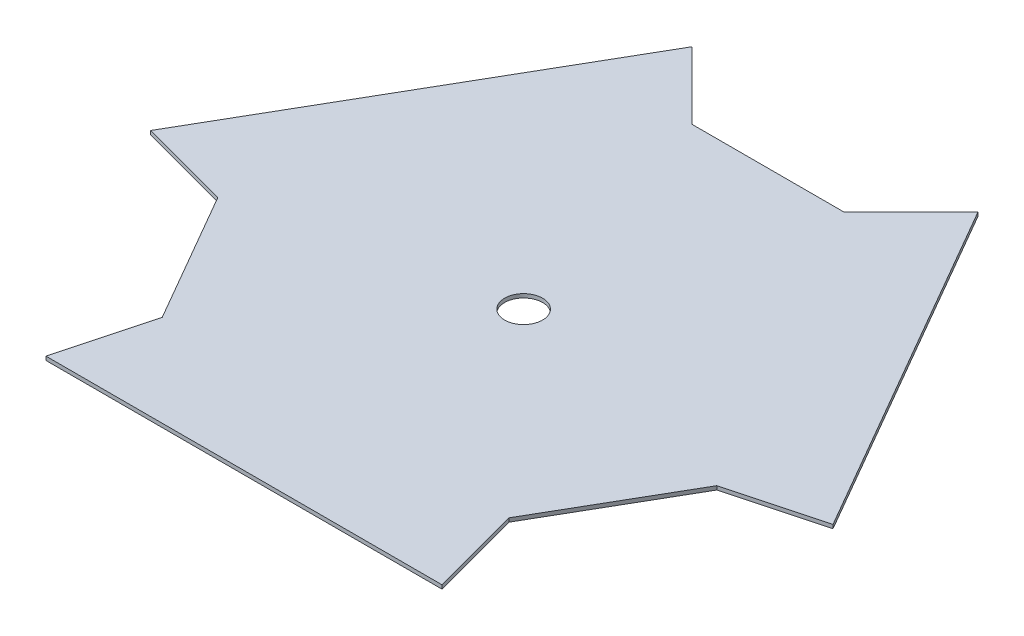
ISO-10303-21;
HEADER;
FILE_DESCRIPTION(('STEP AP214'),'2;1');
FILE_NAME('part.step','',(''),(''),'','','');
FILE_SCHEMA(('AUTOMOTIVE_DESIGN { 1 0 10303 214 1 1 1 1 }'));
ENDSEC;
DATA;
#1=APPLICATION_CONTEXT('core data for automotive mechanical design processes');
#2=APPLICATION_PROTOCOL_DEFINITION('international standard','automotive_design',2000,#1);
#3=PRODUCT_CONTEXT('',#1,'mechanical');
#4=PRODUCT('Part','Part','',(#3));
#5=PRODUCT_RELATED_PRODUCT_CATEGORY('part','',(#4));
#6=PRODUCT_DEFINITION_FORMATION('','',#4);
#7=PRODUCT_DEFINITION_CONTEXT('part definition',#1,'design');
#8=PRODUCT_DEFINITION('design','',#6,#7);
#9=PRODUCT_DEFINITION_SHAPE('','',#8);
#10=(LENGTH_UNIT() NAMED_UNIT(*) SI_UNIT(.MILLI.,.METRE.));
#11=(NAMED_UNIT(*) PLANE_ANGLE_UNIT() SI_UNIT($,.RADIAN.));
#12=(NAMED_UNIT(*) SI_UNIT($,.STERADIAN.) SOLID_ANGLE_UNIT());
#13=UNCERTAINTY_MEASURE_WITH_UNIT(LENGTH_MEASURE(1.E-05),#10,'distance_accuracy_value','');
#14=(GEOMETRIC_REPRESENTATION_CONTEXT(3) GLOBAL_UNCERTAINTY_ASSIGNED_CONTEXT((#13)) GLOBAL_UNIT_ASSIGNED_CONTEXT((#10,
#11,#12)) REPRESENTATION_CONTEXT('',''));
#15=CARTESIAN_POINT('',(0.,0.,0.));
#16=DIRECTION('',(0.,0.,1.));
#17=DIRECTION('',(1.,0.,0.));
#18=AXIS2_PLACEMENT_3D('',#15,#16,#17);
#19=CARTESIAN_POINT('',(-132.853430349157,2.,388.07041555162));
#20=DIRECTION('',(0.,0.,-1.));
#21=DIRECTION('',(-1.,0.,0.));
#22=AXIS2_PLACEMENT_3D('',#19,#20,#21);
#23=PLANE('',#22);
#24=DIRECTION('',(0.,1.,0.));
#25=VECTOR('',#24,1.);
#26=CARTESIAN_POINT('',(104.396227092789,-1.,388.07041555162));
#27=LINE('',#26,#25);
#28=CARTESIAN_POINT('',(104.396227092789,0.,388.07041555162));
#29=VERTEX_POINT('',#28);
#30=CARTESIAN_POINT('',(104.396227092789,2.,388.07041555162));
#31=VERTEX_POINT('',#30);
#32=EDGE_CURVE('E48',#29,#31,#27,.T.);
#33=ORIENTED_EDGE('',*,*,#32,.T.);
#34=DIRECTION('',(1.,0.,0.));
#35=VECTOR('',#34,1.);
#36=CARTESIAN_POINT('',(-132.853430349157,2.,388.07041555162));
#37=LINE('',#36,#35);
#38=CARTESIAN_POINT('',(-104.396227092788,2.,388.07041555162));
#39=VERTEX_POINT('',#38);
#40=EDGE_CURVE('E193',#39,#31,#37,.T.);
#41=ORIENTED_EDGE('',*,*,#40,.F.);
#42=DIRECTION('',(0.,1.,0.));
#43=VECTOR('',#42,1.);
#44=CARTESIAN_POINT('',(-104.396227092788,-1.,388.07041555162));
#45=LINE('',#44,#43);
#46=CARTESIAN_POINT('',(-104.396227092788,0.,388.07041555162));
#47=VERTEX_POINT('',#46);
#48=EDGE_CURVE('E183',#47,#39,#45,.T.);
#49=ORIENTED_EDGE('',*,*,#48,.F.);
#50=DIRECTION('',(1.,0.,0.));
#51=VECTOR('',#50,1.);
#52=CARTESIAN_POINT('',(-132.853430349157,0.,388.07041555162));
#53=LINE('',#52,#51);
#54=EDGE_CURVE('E190',#47,#29,#53,.T.);
#55=ORIENTED_EDGE('',*,*,#54,.T.);
#56=EDGE_LOOP('',(#33,#41,#49,#55));
#57=FACE_BOUND('',#56,.T.);
#58=ADVANCED_FACE('F34',(#57),#23,.F.);
#59=CARTESIAN_POINT('',(61.1769145362399,2.,52.));
#60=DIRECTION('',(-0.866025403784438,0.,0.5));
#61=DIRECTION('',(0.5,0.,0.866025403784438));
#62=AXIS2_PLACEMENT_3D('',#59,#60,#61);
#63=PLANE('',#62);
#64=DIRECTION('',(0.,1.,0.));
#65=VECTOR('',#64,1.);
#66=CARTESIAN_POINT('',(75.4055161644238,-1.,76.6446609406722));
#67=LINE('',#66,#65);
#68=CARTESIAN_POINT('',(75.405516164424,0.,76.6446609406721));
#69=VERTEX_POINT('',#68);
#70=CARTESIAN_POINT('',(75.4055161644238,2.,76.6446609406722));
#71=VERTEX_POINT('',#70);
#72=EDGE_CURVE('E56',#69,#71,#67,.T.);
#73=ORIENTED_EDGE('',*,*,#72,.T.);
#74=DIRECTION('',(-0.5,0.,-0.866025403784438));
#75=VECTOR('',#74,1.);
#76=CARTESIAN_POINT('',(61.1769145362399,2.,52.));
#77=LINE('',#76,#75);
#78=CARTESIAN_POINT('',(179.801743257213,2.,257.46423038388));
#79=VERTEX_POINT('',#78);
#80=EDGE_CURVE('E196',#79,#71,#77,.T.);
#81=ORIENTED_EDGE('',*,*,#80,.F.);
#82=DIRECTION('',(0.,1.,0.));
#83=VECTOR('',#82,1.);
#84=CARTESIAN_POINT('',(179.801743257213,-1.,257.46423038388));
#85=LINE('',#84,#83);
#86=CARTESIAN_POINT('',(179.801743257213,0.,257.46423038388));
#87=VERTEX_POINT('',#86);
#88=EDGE_CURVE('E176',#87,#79,#85,.T.);
#89=ORIENTED_EDGE('',*,*,#88,.F.);
#90=DIRECTION('',(-0.5,0.,-0.866025403784438));
#91=VECTOR('',#90,1.);
#92=CARTESIAN_POINT('',(61.1769145362399,0.,52.));
#93=LINE('',#92,#91);
#94=EDGE_CURVE('E203',#87,#69,#93,.T.);
#95=ORIENTED_EDGE('',*,*,#94,.T.);
#96=EDGE_LOOP('',(#73,#81,#89,#95));
#97=FACE_BOUND('',#96,.T.);
#98=ADVANCED_FACE('F240',(#97),#63,.F.);
#99=CARTESIAN_POINT('',(-194.030344885397,2.,282.108891324553));
#100=DIRECTION('',(0.866025403784438,0.,0.5));
#101=DIRECTION('',(0.5,0.,-0.866025403784438));
#102=AXIS2_PLACEMENT_3D('',#99,#100,#101);
#103=PLANE('',#102);
#104=DIRECTION('',(0.,1.,0.));
#105=VECTOR('',#104,1.);
#106=CARTESIAN_POINT('',(-75.4055161644245,-1.,76.644660940673));
#107=LINE('',#106,#105);
#108=CARTESIAN_POINT('',(-75.4055161644245,0.,76.644660940673));
#109=VERTEX_POINT('',#108);
#110=CARTESIAN_POINT('',(-75.4055161644245,2.,76.644660940673));
#111=VERTEX_POINT('',#110);
#112=EDGE_CURVE('E168',#109,#111,#107,.T.);
#113=ORIENTED_EDGE('',*,*,#112,.F.);
#114=DIRECTION('',(-0.5,0.,0.866025403784438));
#115=VECTOR('',#114,1.);
#116=CARTESIAN_POINT('',(-194.030344885397,0.,282.108891324553));
#117=LINE('',#116,#115);
#118=CARTESIAN_POINT('',(-179.801743257213,0.,257.464230383881));
#119=VERTEX_POINT('',#118);
#120=EDGE_CURVE('E197',#109,#119,#117,.T.);
#121=ORIENTED_EDGE('',*,*,#120,.T.);
#122=DIRECTION('',(0.,1.,0.));
#123=VECTOR('',#122,1.);
#124=CARTESIAN_POINT('',(-179.801743257213,-1.,257.464230383881));
#125=LINE('',#124,#123);
#126=CARTESIAN_POINT('',(-179.801743257213,2.,257.464230383881));
#127=VERTEX_POINT('',#126);
#128=EDGE_CURVE('E132',#119,#127,#125,.T.);
#129=ORIENTED_EDGE('',*,*,#128,.T.);
#130=DIRECTION('',(-0.5,0.,0.866025403784438));
#131=VECTOR('',#130,1.);
#132=CARTESIAN_POINT('',(-194.030344885397,2.,282.108891324553));
#133=LINE('',#132,#131);
#134=EDGE_CURVE('E147',#111,#127,#133,.T.);
#135=ORIENTED_EDGE('',*,*,#134,.F.);
#136=EDGE_LOOP('',(#113,#121,#129,#135));
#137=FACE_BOUND('',#136,.T.);
#138=ADVANCED_FACE('F258',(#137),#103,.F.);
#139=CARTESIAN_POINT('',(0.,2.,0.));
#140=DIRECTION('',(0.,-1.,0.));
#141=DIRECTION('',(0.,0.,-1.));
#142=AXIS2_PLACEMENT_3D('',#139,#140,#141);
#143=PLANE('',#142);
#144=CARTESIAN_POINT('',(0.,2.,240.726435625391));
#145=DIRECTION('',(0.,1.,0.));
#146=DIRECTION('',(0.,0.,1.));
#147=AXIS2_PLACEMENT_3D('',#144,#145,#146);
#148=CIRCLE('',#147,10.);
#149=CARTESIAN_POINT('',(0.,2.,250.726435625391));
#150=VERTEX_POINT('',#149);
#151=EDGE_CURVE('E170',#150,#150,#148,.T.);
#152=ORIENTED_EDGE('',*,*,#151,.F.);
#153=EDGE_LOOP('',(#152));
#154=FACE_BOUND('',#153,.T.);
#155=DIRECTION('',(-0.707106781186555,0.,-0.707106781186539));
#156=VECTOR('',#155,1.);
#157=CARTESIAN_POINT('',(-75.4055161644245,2.,76.644660940673));
#158=LINE('',#157,#156);
#159=CARTESIAN_POINT('',(-40.0501771050967,2.,112.));
#160=VERTEX_POINT('',#159);
#161=EDGE_CURVE('E166',#160,#111,#158,.T.);
#162=ORIENTED_EDGE('',*,*,#161,.T.);
#163=ORIENTED_EDGE('',*,*,#134,.T.);
#164=DIRECTION('',(0.965925826289071,0.,0.25881904510251));
#165=VECTOR('',#164,1.);
#166=CARTESIAN_POINT('',(-131.505451942759,2.,270.405182639007));
#167=LINE('',#166,#165);
#168=CARTESIAN_POINT('',(-131.505451942759,2.,270.405182639007));
#169=VERTEX_POINT('',#168);
#170=EDGE_CURVE('E125',#127,#169,#167,.T.);
#171=ORIENTED_EDGE('',*,*,#170,.T.);
#172=DIRECTION('',(0.5,0.,0.866025403784438));
#173=VECTOR('',#172,1.);
#174=CARTESIAN_POINT('',(-91.4552748376625,2.,339.774124237167));
#175=LINE('',#174,#173);
#176=CARTESIAN_POINT('',(-91.4552748376625,2.,339.774124237167));
#177=VERTEX_POINT('',#176);
#178=EDGE_CURVE('E135',#169,#177,#175,.T.);
#179=ORIENTED_EDGE('',*,*,#178,.T.);
#180=DIRECTION('',(-0.258819045102509,0.,0.965925826289071));
#181=VECTOR('',#180,1.);
#182=CARTESIAN_POINT('',(-104.396227092788,2.,388.07041555162));
#183=LINE('',#182,#181);
#184=EDGE_CURVE('E141',#177,#39,#183,.T.);
#185=ORIENTED_EDGE('',*,*,#184,.T.);
#186=ORIENTED_EDGE('',*,*,#40,.T.);
#187=DIRECTION('',(-0.258819045102532,0.,-0.965925826289065));
#188=VECTOR('',#187,1.);
#189=CARTESIAN_POINT('',(91.4552748376624,2.,339.774124237167));
#190=LINE('',#189,#188);
#191=CARTESIAN_POINT('',(91.4552748376624,2.,339.774124237167));
#192=VERTEX_POINT('',#191);
#193=EDGE_CURVE('E151',#31,#192,#190,.T.);
#194=ORIENTED_EDGE('',*,*,#193,.T.);
#195=DIRECTION('',(0.5,0.,-0.866025403784439));
#196=VECTOR('',#195,1.);
#197=CARTESIAN_POINT('',(131.505451942759,2.,270.405182639007));
#198=LINE('',#197,#196);
#199=CARTESIAN_POINT('',(131.505451942759,2.,270.405182639007));
#200=VERTEX_POINT('',#199);
#201=EDGE_CURVE('E154',#192,#200,#198,.T.);
#202=ORIENTED_EDGE('',*,*,#201,.T.);
#203=DIRECTION('',(0.965925826289065,0.,-0.258819045102532));
#204=VECTOR('',#203,1.);
#205=CARTESIAN_POINT('',(179.801743257213,2.,257.46423038388));
#206=LINE('',#205,#204);
#207=EDGE_CURVE('E157',#200,#79,#206,.T.);
#208=ORIENTED_EDGE('',*,*,#207,.T.);
#209=ORIENTED_EDGE('',*,*,#80,.T.);
#210=DIRECTION('',(-0.707106781186539,0.,0.707106781186556));
#211=VECTOR('',#210,1.);
#212=CARTESIAN_POINT('',(40.0501771050969,2.,112.));
#213=LINE('',#212,#211);
#214=CARTESIAN_POINT('',(40.0501771050969,2.,112.));
#215=VERTEX_POINT('',#214);
#216=EDGE_CURVE('E160',#71,#215,#213,.T.);
#217=ORIENTED_EDGE('',*,*,#216,.T.);
#218=DIRECTION('',(-1.,0.,0.));
#219=VECTOR('',#218,1.);
#220=CARTESIAN_POINT('',(-40.0501771050967,2.,112.));
#221=LINE('',#220,#219);
#222=EDGE_CURVE('E163',#215,#160,#221,.T.);
#223=ORIENTED_EDGE('',*,*,#222,.T.);
#224=EDGE_LOOP('',(#162,#163,#171,#179,#185,#186,#194,#202,#208,#209,#217,#223));
#225=FACE_BOUND('',#224,.T.);
#226=ADVANCED_FACE('F145',(#154,#225),#143,.F.);
#227=CARTESIAN_POINT('',(0.,0.,0.));
#228=DIRECTION('',(0.,-1.,0.));
#229=DIRECTION('',(0.,0.,-1.));
#230=AXIS2_PLACEMENT_3D('',#227,#228,#229);
#231=PLANE('',#230);
#232=CARTESIAN_POINT('',(0.,0.,240.726435625391));
#233=DIRECTION('',(0.,1.,0.));
#234=DIRECTION('',(0.,0.,1.));
#235=AXIS2_PLACEMENT_3D('',#232,#233,#234);
#236=CIRCLE('',#235,10.);
#237=CARTESIAN_POINT('',(0.,0.,250.726435625391));
#238=VERTEX_POINT('',#237);
#239=EDGE_CURVE('E187',#238,#238,#236,.T.);
#240=ORIENTED_EDGE('',*,*,#239,.T.);
#241=EDGE_LOOP('',(#240));
#242=FACE_BOUND('',#241,.T.);
#243=ORIENTED_EDGE('',*,*,#120,.F.);
#244=DIRECTION('',(0.707106781186555,0.,0.70710678118654));
#245=VECTOR('',#244,1.);
#246=CARTESIAN_POINT('',(-76.0250885525479,0.,76.0250885525496));
#247=LINE('',#246,#245);
#248=CARTESIAN_POINT('',(-40.0501771050967,0.,112.));
#249=VERTEX_POINT('',#248);
#250=EDGE_CURVE('E12',#109,#249,#247,.T.);
#251=ORIENTED_EDGE('',*,*,#250,.T.);
#252=DIRECTION('',(1.,0.,0.));
#253=VECTOR('',#252,1.);
#254=CARTESIAN_POINT('',(0.,0.,112.));
#255=LINE('',#254,#253);
#256=CARTESIAN_POINT('',(40.0501771050969,0.,112.));
#257=VERTEX_POINT('',#256);
#258=EDGE_CURVE('E41',#249,#257,#255,.T.);
#259=ORIENTED_EDGE('',*,*,#258,.T.);
#260=DIRECTION('',(0.707106781186539,0.,-0.707106781186556));
#261=VECTOR('',#260,1.);
#262=CARTESIAN_POINT('',(76.0250885525489,0.,76.0250885525472));
#263=LINE('',#262,#261);
#264=EDGE_CURVE('E222',#257,#69,#263,.T.);
#265=ORIENTED_EDGE('',*,*,#264,.T.);
#266=ORIENTED_EDGE('',*,*,#94,.F.);
#267=DIRECTION('',(-0.965925826289065,0.,0.258819045102532));
#268=VECTOR('',#267,1.);
#269=CARTESIAN_POINT('',(76.4104905718433,0.,285.167833045369));
#270=LINE('',#269,#268);
#271=CARTESIAN_POINT('',(131.505451942759,0.,270.405182639007));
#272=VERTEX_POINT('',#271);
#273=EDGE_CURVE('E219',#87,#272,#270,.T.);
#274=ORIENTED_EDGE('',*,*,#273,.T.);
#275=DIRECTION('',(-0.5,0.,0.866025403784439));
#276=VECTOR('',#275,1.);
#277=CARTESIAN_POINT('',(215.717967697245,0.,124.544826719043));
#278=LINE('',#277,#276);
#279=CARTESIAN_POINT('',(91.4552748376624,0.,339.774124237167));
#280=VERTEX_POINT('',#279);
#281=EDGE_CURVE('E216',#272,#280,#278,.T.);
#282=ORIENTED_EDGE('',*,*,#281,.T.);
#283=DIRECTION('',(0.258819045102532,0.,0.965925826289065));
#284=VECTOR('',#283,1.);
#285=CARTESIAN_POINT('',(0.385402019287201,0.,-0.103268159829334));
#286=LINE('',#285,#284);
#287=EDGE_CURVE('E214',#280,#29,#286,.T.);
#288=ORIENTED_EDGE('',*,*,#287,.T.);
#289=ORIENTED_EDGE('',*,*,#54,.F.);
#290=DIRECTION('',(0.258819045102509,0.,-0.965925826289071));
#291=VECTOR('',#290,1.);
#292=CARTESIAN_POINT('',(-0.385402019295434,0.,-0.10326815983153));
#293=LINE('',#292,#291);
#294=CARTESIAN_POINT('',(-91.4552748376625,0.,339.774124237167));
#295=VERTEX_POINT('',#294);
#296=EDGE_CURVE('E211',#47,#295,#293,.T.);
#297=ORIENTED_EDGE('',*,*,#296,.T.);
#298=DIRECTION('',(-0.500000000000001,0.,-0.866025403784438));
#299=VECTOR('',#298,1.);
#300=CARTESIAN_POINT('',(-215.717967697245,0.,124.544826719044));
#301=LINE('',#300,#299);
#302=CARTESIAN_POINT('',(-131.505451942759,0.,270.405182639007));
#303=VERTEX_POINT('',#302);
#304=EDGE_CURVE('E209',#295,#303,#301,.T.);
#305=ORIENTED_EDGE('',*,*,#304,.T.);
#306=DIRECTION('',(-0.965925826289071,0.,-0.25881904510251));
#307=VECTOR('',#306,1.);
#308=CARTESIAN_POINT('',(-76.4104905718363,0.,285.167833045369));
#309=LINE('',#308,#307);
#310=EDGE_CURVE('E128',#303,#119,#309,.T.);
#311=ORIENTED_EDGE('',*,*,#310,.T.);
#312=EDGE_LOOP('',(#243,#251,#259,#265,#266,#274,#282,#288,#289,#297,#305,#311));
#313=FACE_BOUND('',#312,.T.);
#314=ADVANCED_FACE('F226',(#242,#313),#231,.T.);
#315=CARTESIAN_POINT('',(0.,0.,240.726435625391));
#316=DIRECTION('',(0.,1.,0.));
#317=DIRECTION('',(0.,0.,1.));
#318=AXIS2_PLACEMENT_3D('',#315,#316,#317);
#319=CYLINDRICAL_SURFACE('',#318,10.);
#320=ORIENTED_EDGE('',*,*,#239,.F.);
#321=EDGE_LOOP('',(#320));
#322=FACE_BOUND('',#321,.T.);
#323=ORIENTED_EDGE('',*,*,#151,.T.);
#324=EDGE_LOOP('',(#323));
#325=FACE_BOUND('',#324,.T.);
#326=ADVANCED_FACE('F295',(#322,#325),#319,.F.);
#327=CARTESIAN_POINT('',(-131.505451942759,-1.,270.405182639007));
#328=DIRECTION('',(-0.25881904510251,0.,0.965925826289071));
#329=DIRECTION('',(0.965925826289071,0.,0.25881904510251));
#330=AXIS2_PLACEMENT_3D('',#327,#328,#329);
#331=PLANE('',#330);
#332=DIRECTION('',(0.,1.,0.));
#333=VECTOR('',#332,1.);
#334=CARTESIAN_POINT('',(-131.505451942759,-1.,270.405182639007));
#335=LINE('',#334,#333);
#336=EDGE_CURVE('E121',#303,#169,#335,.T.);
#337=ORIENTED_EDGE('',*,*,#336,.T.);
#338=ORIENTED_EDGE('',*,*,#170,.F.);
#339=ORIENTED_EDGE('',*,*,#128,.F.);
#340=ORIENTED_EDGE('',*,*,#310,.F.);
#341=EDGE_LOOP('',(#337,#338,#339,#340));
#342=FACE_BOUND('',#341,.T.);
#343=ADVANCED_FACE('F123',(#342),#331,.T.);
#344=CARTESIAN_POINT('',(-91.4552748376625,-1.,339.774124237167));
#345=DIRECTION('',(-0.866025403784438,0.,0.500000000000001));
#346=DIRECTION('',(0.500000000000001,0.,0.866025403784438));
#347=AXIS2_PLACEMENT_3D('',#344,#345,#346);
#348=PLANE('',#347);
#349=DIRECTION('',(0.,1.,0.));
#350=VECTOR('',#349,1.);
#351=CARTESIAN_POINT('',(-91.4552748376625,-1.,339.774124237167));
#352=LINE('',#351,#350);
#353=EDGE_CURVE('E131',#295,#177,#352,.T.);
#354=ORIENTED_EDGE('',*,*,#353,.T.);
#355=ORIENTED_EDGE('',*,*,#178,.F.);
#356=ORIENTED_EDGE('',*,*,#336,.F.);
#357=ORIENTED_EDGE('',*,*,#304,.F.);
#358=EDGE_LOOP('',(#354,#355,#356,#357));
#359=FACE_BOUND('',#358,.T.);
#360=ADVANCED_FACE('F136',(#359),#348,.T.);
#361=CARTESIAN_POINT('',(-104.396227092788,-1.,388.07041555162));
#362=DIRECTION('',(-0.965925826289071,0.,-0.258819045102509));
#363=DIRECTION('',(-0.258819045102509,0.,0.965925826289071));
#364=AXIS2_PLACEMENT_3D('',#361,#362,#363);
#365=PLANE('',#364);
#366=ORIENTED_EDGE('',*,*,#48,.T.);
#367=ORIENTED_EDGE('',*,*,#184,.F.);
#368=ORIENTED_EDGE('',*,*,#353,.F.);
#369=ORIENTED_EDGE('',*,*,#296,.F.);
#370=EDGE_LOOP('',(#366,#367,#368,#369));
#371=FACE_BOUND('',#370,.T.);
#372=ADVANCED_FACE('F256',(#371),#365,.T.);
#373=CARTESIAN_POINT('',(91.4552748376624,-1.,339.774124237167));
#374=DIRECTION('',(0.965925826289065,0.,-0.258819045102532));
#375=DIRECTION('',(-0.258819045102532,0.,-0.965925826289065));
#376=AXIS2_PLACEMENT_3D('',#373,#374,#375);
#377=PLANE('',#376);
#378=DIRECTION('',(0.,1.,0.));
#379=VECTOR('',#378,1.);
#380=CARTESIAN_POINT('',(91.4552748376624,-1.,339.774124237167));
#381=LINE('',#380,#379);
#382=EDGE_CURVE('E180',#280,#192,#381,.T.);
#383=ORIENTED_EDGE('',*,*,#382,.T.);
#384=ORIENTED_EDGE('',*,*,#193,.F.);
#385=ORIENTED_EDGE('',*,*,#32,.F.);
#386=ORIENTED_EDGE('',*,*,#287,.F.);
#387=EDGE_LOOP('',(#383,#384,#385,#386));
#388=FACE_BOUND('',#387,.T.);
#389=ADVANCED_FACE('F250',(#388),#377,.T.);
#390=CARTESIAN_POINT('',(131.505451942759,-1.,270.405182639007));
#391=DIRECTION('',(0.866025403784439,0.,0.5));
#392=DIRECTION('',(0.5,0.,-0.866025403784439));
#393=AXIS2_PLACEMENT_3D('',#390,#391,#392);
#394=PLANE('',#393);
#395=DIRECTION('',(0.,1.,0.));
#396=VECTOR('',#395,1.);
#397=CARTESIAN_POINT('',(131.505451942759,-1.,270.405182639007));
#398=LINE('',#397,#396);
#399=EDGE_CURVE('E178',#272,#200,#398,.T.);
#400=ORIENTED_EDGE('',*,*,#399,.T.);
#401=ORIENTED_EDGE('',*,*,#201,.F.);
#402=ORIENTED_EDGE('',*,*,#382,.F.);
#403=ORIENTED_EDGE('',*,*,#281,.F.);
#404=EDGE_LOOP('',(#400,#401,#402,#403));
#405=FACE_BOUND('',#404,.T.);
#406=ADVANCED_FACE('F248',(#405),#394,.T.);
#407=CARTESIAN_POINT('',(179.801743257213,-1.,257.46423038388));
#408=DIRECTION('',(0.258819045102532,0.,0.965925826289065));
#409=DIRECTION('',(0.965925826289065,0.,-0.258819045102532));
#410=AXIS2_PLACEMENT_3D('',#407,#408,#409);
#411=PLANE('',#410);
#412=ORIENTED_EDGE('',*,*,#88,.T.);
#413=ORIENTED_EDGE('',*,*,#207,.F.);
#414=ORIENTED_EDGE('',*,*,#399,.F.);
#415=ORIENTED_EDGE('',*,*,#273,.F.);
#416=EDGE_LOOP('',(#412,#413,#414,#415));
#417=FACE_BOUND('',#416,.T.);
#418=ADVANCED_FACE('F244',(#417),#411,.T.);
#419=CARTESIAN_POINT('',(-75.4055161644245,-1.,76.644660940673));
#420=DIRECTION('',(0.70710678118654,0.,-0.707106781186555));
#421=DIRECTION('',(-0.707106781186555,0.,-0.70710678118654));
#422=AXIS2_PLACEMENT_3D('',#419,#420,#421);
#423=PLANE('',#422);
#424=ORIENTED_EDGE('',*,*,#112,.T.);
#425=ORIENTED_EDGE('',*,*,#161,.F.);
#426=DIRECTION('',(0.,1.,0.));
#427=VECTOR('',#426,1.);
#428=CARTESIAN_POINT('',(-40.0501771050967,-1.,112.));
#429=LINE('',#428,#427);
#430=EDGE_CURVE('E171',#249,#160,#429,.T.);
#431=ORIENTED_EDGE('',*,*,#430,.F.);
#432=ORIENTED_EDGE('',*,*,#250,.F.);
#433=EDGE_LOOP('',(#424,#425,#431,#432));
#434=FACE_BOUND('',#433,.T.);
#435=ADVANCED_FACE('F235',(#434),#423,.T.);
#436=CARTESIAN_POINT('',(-40.0501771050967,-1.,112.));
#437=DIRECTION('',(0.,0.,-1.));
#438=DIRECTION('',(-1.,0.,0.));
#439=AXIS2_PLACEMENT_3D('',#436,#437,#438);
#440=PLANE('',#439);
#441=ORIENTED_EDGE('',*,*,#430,.T.);
#442=ORIENTED_EDGE('',*,*,#222,.F.);
#443=DIRECTION('',(0.,1.,0.));
#444=VECTOR('',#443,1.);
#445=CARTESIAN_POINT('',(40.0501771050969,-1.,112.));
#446=LINE('',#445,#444);
#447=EDGE_CURVE('E173',#257,#215,#446,.T.);
#448=ORIENTED_EDGE('',*,*,#447,.F.);
#449=ORIENTED_EDGE('',*,*,#258,.F.);
#450=EDGE_LOOP('',(#441,#442,#448,#449));
#451=FACE_BOUND('',#450,.T.);
#452=ADVANCED_FACE('F231',(#451),#440,.T.);
#453=CARTESIAN_POINT('',(40.0501771050969,-1.,112.));
#454=DIRECTION('',(-0.707106781186555,0.,-0.707106781186539));
#455=DIRECTION('',(-0.707106781186539,0.,0.707106781186556));
#456=AXIS2_PLACEMENT_3D('',#453,#454,#455);
#457=PLANE('',#456);
#458=ORIENTED_EDGE('',*,*,#447,.T.);
#459=ORIENTED_EDGE('',*,*,#216,.F.);
#460=ORIENTED_EDGE('',*,*,#72,.F.);
#461=ORIENTED_EDGE('',*,*,#264,.F.);
#462=EDGE_LOOP('',(#458,#459,#460,#461));
#463=FACE_BOUND('',#462,.T.);
#464=ADVANCED_FACE('F238',(#463),#457,.T.);
#465=CLOSED_SHELL('',(#58,#98,#138,#226,#314,#326,#343,#360,#372,#389,#406,#418,#435,#452,#464));
#466=MANIFOLD_SOLID_BREP('B2',#465);
#467=ADVANCED_BREP_SHAPE_REPRESENTATION('',(#18,#466),#14);
#468=SHAPE_DEFINITION_REPRESENTATION(#9,#467);
ENDSEC;
END-ISO-10303-21;
